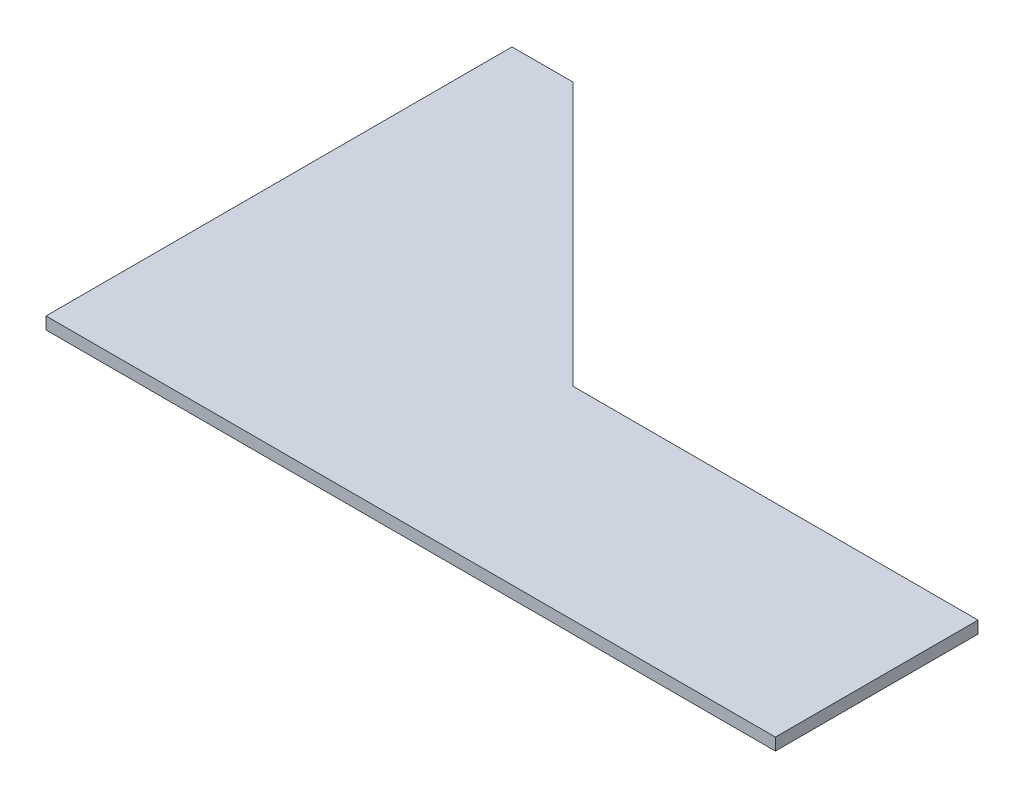
ISO-10303-21;
HEADER;
FILE_DESCRIPTION(('STEP AP214'),'2;1');
FILE_NAME('part.step','',(''),(''),'','','');
FILE_SCHEMA(('AUTOMOTIVE_DESIGN { 1 0 10303 214 1 1 1 1 }'));
ENDSEC;
DATA;
#1=APPLICATION_CONTEXT('core data for automotive mechanical design processes');
#2=APPLICATION_PROTOCOL_DEFINITION('international standard','automotive_design',2000,#1);
#3=PRODUCT_CONTEXT('',#1,'mechanical');
#4=PRODUCT('Part','Part','',(#3));
#5=PRODUCT_RELATED_PRODUCT_CATEGORY('part','',(#4));
#6=PRODUCT_DEFINITION_FORMATION('','',#4);
#7=PRODUCT_DEFINITION_CONTEXT('part definition',#1,'design');
#8=PRODUCT_DEFINITION('design','',#6,#7);
#9=PRODUCT_DEFINITION_SHAPE('','',#8);
#10=(LENGTH_UNIT() NAMED_UNIT(*) SI_UNIT(.MILLI.,.METRE.));
#11=(NAMED_UNIT(*) PLANE_ANGLE_UNIT() SI_UNIT($,.RADIAN.));
#12=(NAMED_UNIT(*) SI_UNIT($,.STERADIAN.) SOLID_ANGLE_UNIT());
#13=UNCERTAINTY_MEASURE_WITH_UNIT(LENGTH_MEASURE(1.E-05),#10,'distance_accuracy_value','');
#14=(GEOMETRIC_REPRESENTATION_CONTEXT(3) GLOBAL_UNCERTAINTY_ASSIGNED_CONTEXT((#13)) GLOBAL_UNIT_ASSIGNED_CONTEXT((#10,
#11,#12)) REPRESENTATION_CONTEXT('',''));
#15=CARTESIAN_POINT('',(0.,0.,0.));
#16=DIRECTION('',(0.,0.,1.));
#17=DIRECTION('',(1.,0.,0.));
#18=AXIS2_PLACEMENT_3D('',#15,#16,#17);
#19=CARTESIAN_POINT('',(0.,6.,0.));
#20=DIRECTION('',(0.,0.,-1.));
#21=DIRECTION('',(-1.,0.,0.));
#22=AXIS2_PLACEMENT_3D('',#19,#20,#21);
#23=PLANE('',#22);
#24=DIRECTION('',(1.,0.,0.));
#25=VECTOR('',#24,1.);
#26=CARTESIAN_POINT('',(0.,0.,0.));
#27=LINE('',#26,#25);
#28=CARTESIAN_POINT('',(0.,0.,0.));
#29=VERTEX_POINT('',#28);
#30=CARTESIAN_POINT('',(360.,0.,0.));
#31=VERTEX_POINT('',#30);
#32=EDGE_CURVE('E117',#29,#31,#27,.T.);
#33=ORIENTED_EDGE('',*,*,#32,.T.);
#34=DIRECTION('',(0.,-1.,0.));
#35=VECTOR('',#34,1.);
#36=CARTESIAN_POINT('',(360.,6.,0.));
#37=LINE('',#36,#35);
#38=CARTESIAN_POINT('',(360.,6.,0.));
#39=VERTEX_POINT('',#38);
#40=EDGE_CURVE('E11',#39,#31,#37,.T.);
#41=ORIENTED_EDGE('',*,*,#40,.F.);
#42=DIRECTION('',(1.,0.,0.));
#43=VECTOR('',#42,1.);
#44=CARTESIAN_POINT('',(0.,6.,0.));
#45=LINE('',#44,#43);
#46=CARTESIAN_POINT('',(0.,6.,0.));
#47=VERTEX_POINT('',#46);
#48=EDGE_CURVE('E127',#47,#39,#45,.T.);
#49=ORIENTED_EDGE('',*,*,#48,.F.);
#50=DIRECTION('',(0.,-1.,0.));
#51=VECTOR('',#50,1.);
#52=CARTESIAN_POINT('',(0.,6.,0.));
#53=LINE('',#52,#51);
#54=EDGE_CURVE('E113',#47,#29,#53,.T.);
#55=ORIENTED_EDGE('',*,*,#54,.T.);
#56=EDGE_LOOP('',(#33,#41,#49,#55));
#57=FACE_BOUND('',#56,.T.);
#58=ADVANCED_FACE('F33',(#57),#23,.F.);
#59=CARTESIAN_POINT('',(360.,6.,0.));
#60=DIRECTION('',(-1.,0.,0.));
#61=DIRECTION('',(0.,0.,1.));
#62=AXIS2_PLACEMENT_3D('',#59,#60,#61);
#63=PLANE('',#62);
#64=DIRECTION('',(0.,0.,-1.));
#65=VECTOR('',#64,1.);
#66=CARTESIAN_POINT('',(360.,0.,0.));
#67=LINE('',#66,#65);
#68=CARTESIAN_POINT('',(360.,0.,-100.));
#69=VERTEX_POINT('',#68);
#70=EDGE_CURVE('E120',#31,#69,#67,.T.);
#71=ORIENTED_EDGE('',*,*,#70,.T.);
#72=DIRECTION('',(0.,-1.,0.));
#73=VECTOR('',#72,1.);
#74=CARTESIAN_POINT('',(360.,6.,-100.));
#75=LINE('',#74,#73);
#76=CARTESIAN_POINT('',(360.,6.,-100.));
#77=VERTEX_POINT('',#76);
#78=EDGE_CURVE('E41',#77,#69,#75,.T.);
#79=ORIENTED_EDGE('',*,*,#78,.F.);
#80=DIRECTION('',(0.,0.,-1.));
#81=VECTOR('',#80,1.);
#82=CARTESIAN_POINT('',(360.,6.,0.));
#83=LINE('',#82,#81);
#84=EDGE_CURVE('E86',#39,#77,#83,.T.);
#85=ORIENTED_EDGE('',*,*,#84,.F.);
#86=ORIENTED_EDGE('',*,*,#40,.T.);
#87=EDGE_LOOP('',(#71,#79,#85,#86));
#88=FACE_BOUND('',#87,.T.);
#89=ADVANCED_FACE('F151',(#88),#63,.F.);
#90=CARTESIAN_POINT('',(360.,6.,-100.));
#91=DIRECTION('',(0.,0.,1.));
#92=DIRECTION('',(1.,0.,0.));
#93=AXIS2_PLACEMENT_3D('',#90,#91,#92);
#94=PLANE('',#93);
#95=DIRECTION('',(-1.,0.,0.));
#96=VECTOR('',#95,1.);
#97=CARTESIAN_POINT('',(360.,0.,-100.));
#98=LINE('',#97,#96);
#99=CARTESIAN_POINT('',(160.,0.,-99.9999999999999));
#100=VERTEX_POINT('',#99);
#101=EDGE_CURVE('E122',#69,#100,#98,.T.);
#102=ORIENTED_EDGE('',*,*,#101,.T.);
#103=DIRECTION('',(0.,-1.,0.));
#104=VECTOR('',#103,1.);
#105=CARTESIAN_POINT('',(160.,6.,-99.9999999999999));
#106=LINE('',#105,#104);
#107=CARTESIAN_POINT('',(160.,6.,-99.9999999999999));
#108=VERTEX_POINT('',#107);
#109=EDGE_CURVE('E108',#108,#100,#106,.T.);
#110=ORIENTED_EDGE('',*,*,#109,.F.);
#111=DIRECTION('',(-1.,0.,0.));
#112=VECTOR('',#111,1.);
#113=CARTESIAN_POINT('',(360.,6.,-100.));
#114=LINE('',#113,#112);
#115=EDGE_CURVE('E99',#77,#108,#114,.T.);
#116=ORIENTED_EDGE('',*,*,#115,.F.);
#117=ORIENTED_EDGE('',*,*,#78,.T.);
#118=EDGE_LOOP('',(#102,#110,#116,#117));
#119=FACE_BOUND('',#118,.T.);
#120=ADVANCED_FACE('F133',(#119),#94,.F.);
#121=CARTESIAN_POINT('',(30.,6.,-230.));
#122=DIRECTION('',(-0.707106781186548,0.,0.707106781186547));
#123=DIRECTION('',(0.707106781186547,0.,0.707106781186548));
#124=AXIS2_PLACEMENT_3D('',#121,#122,#123);
#125=PLANE('',#124);
#126=DIRECTION('',(-0.707106781186547,0.,-0.707106781186548));
#127=VECTOR('',#126,1.);
#128=CARTESIAN_POINT('',(30.,0.,-230.));
#129=LINE('',#128,#127);
#130=CARTESIAN_POINT('',(30.,0.,-230.));
#131=VERTEX_POINT('',#130);
#132=EDGE_CURVE('E107',#100,#131,#129,.T.);
#133=ORIENTED_EDGE('',*,*,#132,.T.);
#134=DIRECTION('',(0.,-1.,0.));
#135=VECTOR('',#134,1.);
#136=CARTESIAN_POINT('',(30.,6.,-230.));
#137=LINE('',#136,#135);
#138=CARTESIAN_POINT('',(30.,6.,-230.));
#139=VERTEX_POINT('',#138);
#140=EDGE_CURVE('E104',#139,#131,#137,.T.);
#141=ORIENTED_EDGE('',*,*,#140,.F.);
#142=DIRECTION('',(-0.707106781186547,0.,-0.707106781186548));
#143=VECTOR('',#142,1.);
#144=CARTESIAN_POINT('',(30.,6.,-230.));
#145=LINE('',#144,#143);
#146=EDGE_CURVE('E93',#108,#139,#145,.T.);
#147=ORIENTED_EDGE('',*,*,#146,.F.);
#148=ORIENTED_EDGE('',*,*,#109,.T.);
#149=EDGE_LOOP('',(#133,#141,#147,#148));
#150=FACE_BOUND('',#149,.T.);
#151=ADVANCED_FACE('F105',(#150),#125,.F.);
#152=CARTESIAN_POINT('',(0.,6.,-230.));
#153=DIRECTION('',(0.,0.,1.));
#154=DIRECTION('',(1.,0.,0.));
#155=AXIS2_PLACEMENT_3D('',#152,#153,#154);
#156=PLANE('',#155);
#157=DIRECTION('',(-1.,0.,0.));
#158=VECTOR('',#157,1.);
#159=CARTESIAN_POINT('',(0.,0.,-230.));
#160=LINE('',#159,#158);
#161=CARTESIAN_POINT('',(0.,0.,-230.));
#162=VERTEX_POINT('',#161);
#163=EDGE_CURVE('E72',#131,#162,#160,.T.);
#164=ORIENTED_EDGE('',*,*,#163,.T.);
#165=DIRECTION('',(0.,-1.,0.));
#166=VECTOR('',#165,1.);
#167=CARTESIAN_POINT('',(0.,6.,-230.));
#168=LINE('',#167,#166);
#169=CARTESIAN_POINT('',(0.,6.,-230.));
#170=VERTEX_POINT('',#169);
#171=EDGE_CURVE('E109',#170,#162,#168,.T.);
#172=ORIENTED_EDGE('',*,*,#171,.F.);
#173=DIRECTION('',(-1.,0.,0.));
#174=VECTOR('',#173,1.);
#175=CARTESIAN_POINT('',(0.,6.,-230.));
#176=LINE('',#175,#174);
#177=EDGE_CURVE('E97',#139,#170,#176,.T.);
#178=ORIENTED_EDGE('',*,*,#177,.F.);
#179=ORIENTED_EDGE('',*,*,#140,.T.);
#180=EDGE_LOOP('',(#164,#172,#178,#179));
#181=FACE_BOUND('',#180,.T.);
#182=ADVANCED_FACE('F111',(#181),#156,.F.);
#183=CARTESIAN_POINT('',(0.,6.,0.));
#184=DIRECTION('',(1.,0.,0.));
#185=DIRECTION('',(0.,0.,-1.));
#186=AXIS2_PLACEMENT_3D('',#183,#184,#185);
#187=PLANE('',#186);
#188=DIRECTION('',(0.,0.,1.));
#189=VECTOR('',#188,1.);
#190=CARTESIAN_POINT('',(0.,0.,0.));
#191=LINE('',#190,#189);
#192=EDGE_CURVE('E78',#162,#29,#191,.T.);
#193=ORIENTED_EDGE('',*,*,#192,.T.);
#194=ORIENTED_EDGE('',*,*,#54,.F.);
#195=DIRECTION('',(0.,0.,1.));
#196=VECTOR('',#195,1.);
#197=CARTESIAN_POINT('',(0.,6.,0.));
#198=LINE('',#197,#196);
#199=EDGE_CURVE('E49',#170,#47,#198,.T.);
#200=ORIENTED_EDGE('',*,*,#199,.F.);
#201=ORIENTED_EDGE('',*,*,#171,.T.);
#202=EDGE_LOOP('',(#193,#194,#200,#201));
#203=FACE_BOUND('',#202,.T.);
#204=ADVANCED_FACE('F140',(#203),#187,.F.);
#205=CARTESIAN_POINT('',(0.,6.,0.));
#206=DIRECTION('',(0.,1.,0.));
#207=DIRECTION('',(0.,0.,1.));
#208=AXIS2_PLACEMENT_3D('',#205,#206,#207);
#209=PLANE('',#208);
#210=ORIENTED_EDGE('',*,*,#48,.T.);
#211=ORIENTED_EDGE('',*,*,#84,.T.);
#212=ORIENTED_EDGE('',*,*,#115,.T.);
#213=ORIENTED_EDGE('',*,*,#146,.T.);
#214=ORIENTED_EDGE('',*,*,#177,.T.);
#215=ORIENTED_EDGE('',*,*,#199,.T.);
#216=EDGE_LOOP('',(#210,#211,#212,#213,#214,#215));
#217=FACE_BOUND('',#216,.T.);
#218=ADVANCED_FACE('F95',(#217),#209,.T.);
#219=CARTESIAN_POINT('',(0.,0.,0.));
#220=DIRECTION('',(0.,1.,0.));
#221=DIRECTION('',(0.,0.,1.));
#222=AXIS2_PLACEMENT_3D('',#219,#220,#221);
#223=PLANE('',#222);
#224=ORIENTED_EDGE('',*,*,#32,.F.);
#225=ORIENTED_EDGE('',*,*,#192,.F.);
#226=ORIENTED_EDGE('',*,*,#163,.F.);
#227=ORIENTED_EDGE('',*,*,#132,.F.);
#228=ORIENTED_EDGE('',*,*,#101,.F.);
#229=ORIENTED_EDGE('',*,*,#70,.F.);
#230=EDGE_LOOP('',(#224,#225,#226,#227,#228,#229));
#231=FACE_BOUND('',#230,.T.);
#232=ADVANCED_FACE('F136',(#231),#223,.F.);
#233=CLOSED_SHELL('',(#58,#89,#120,#151,#182,#204,#218,#232));
#234=MANIFOLD_SOLID_BREP('B2',#233);
#235=ADVANCED_BREP_SHAPE_REPRESENTATION('',(#18,#234),#14);
#236=SHAPE_DEFINITION_REPRESENTATION(#9,#235);
ENDSEC;
END-ISO-10303-21;
